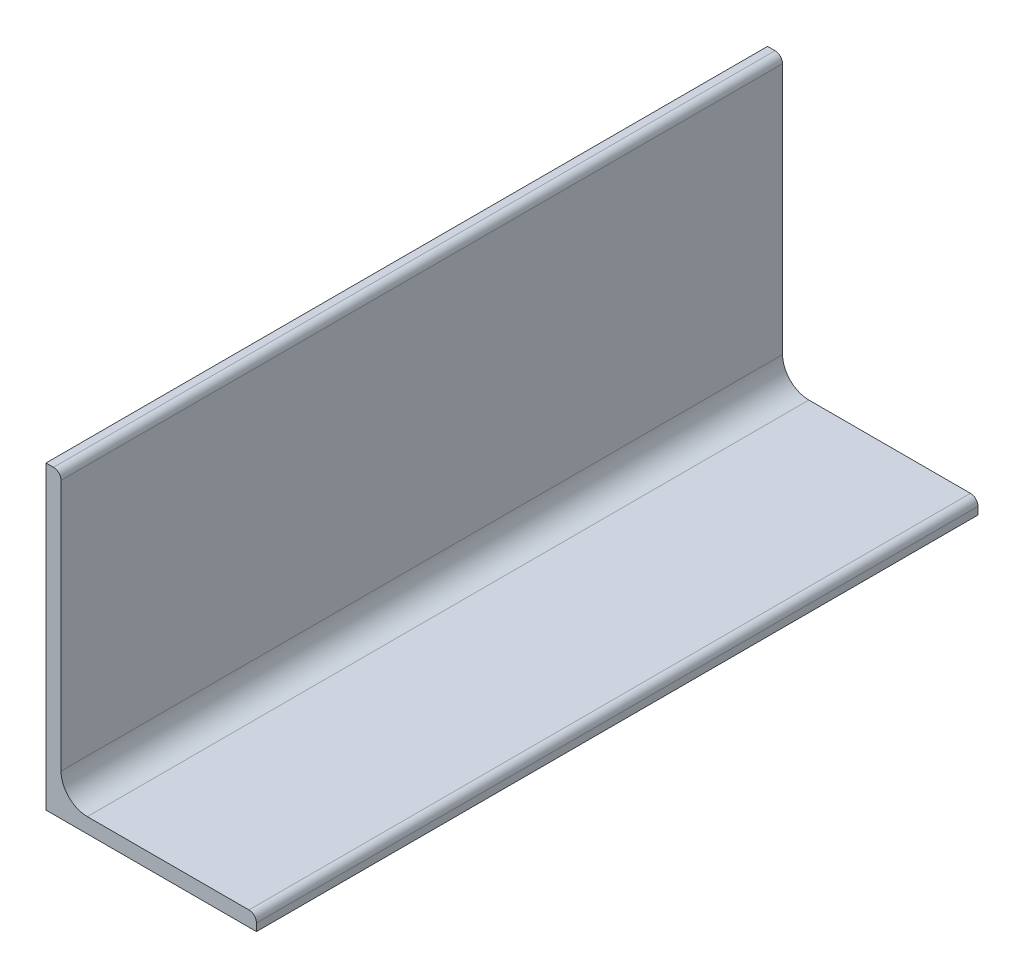
ISO-10303-21;
HEADER;
FILE_DESCRIPTION(('STEP AP214'),'2;1');
FILE_NAME('part.step','',(''),(''),'','','');
FILE_SCHEMA(('AUTOMOTIVE_DESIGN { 1 0 10303 214 1 1 1 1 }'));
ENDSEC;
DATA;
#1=APPLICATION_CONTEXT('core data for automotive mechanical design processes');
#2=APPLICATION_PROTOCOL_DEFINITION('international standard','automotive_design',2000,#1);
#3=PRODUCT_CONTEXT('',#1,'mechanical');
#4=PRODUCT('Part','Part','',(#3));
#5=PRODUCT_RELATED_PRODUCT_CATEGORY('part','',(#4));
#6=PRODUCT_DEFINITION_FORMATION('','',#4);
#7=PRODUCT_DEFINITION_CONTEXT('part definition',#1,'design');
#8=PRODUCT_DEFINITION('design','',#6,#7);
#9=PRODUCT_DEFINITION_SHAPE('','',#8);
#10=(LENGTH_UNIT() NAMED_UNIT(*) SI_UNIT(.MILLI.,.METRE.));
#11=(NAMED_UNIT(*) PLANE_ANGLE_UNIT() SI_UNIT($,.RADIAN.));
#12=(NAMED_UNIT(*) SI_UNIT($,.STERADIAN.) SOLID_ANGLE_UNIT());
#13=UNCERTAINTY_MEASURE_WITH_UNIT(LENGTH_MEASURE(1.E-05),#10,'distance_accuracy_value','');
#14=(GEOMETRIC_REPRESENTATION_CONTEXT(3) GLOBAL_UNCERTAINTY_ASSIGNED_CONTEXT((#13)) GLOBAL_UNIT_ASSIGNED_CONTEXT((#10,
#11,#12)) REPRESENTATION_CONTEXT('',''));
#15=CARTESIAN_POINT('',(0.,0.,0.));
#16=DIRECTION('',(0.,0.,1.));
#17=DIRECTION('',(1.,0.,0.));
#18=AXIS2_PLACEMENT_3D('',#15,#16,#17);
#19=CARTESIAN_POINT('',(0.0836264027816469,127.041655270204,304.8));
#20=DIRECTION('',(1.,0.,0.));
#21=DIRECTION('',(0.,0.,-1.));
#22=AXIS2_PLACEMENT_3D('',#19,#20,#21);
#23=PLANE('',#22);
#24=DIRECTION('',(0.,-1.,0.));
#25=VECTOR('',#24,1.);
#26=CARTESIAN_POINT('',(0.0836264027816469,127.041655270204,0.));
#27=LINE('',#26,#25);
#28=CARTESIAN_POINT('',(0.0836264027816469,127.041655270204,0.));
#29=VERTEX_POINT('',#28);
#30=CARTESIAN_POINT('',(0.0836264027816469,0.0416552702040917,0.));
#31=VERTEX_POINT('',#30);
#32=EDGE_CURVE('E135',#29,#31,#27,.T.);
#33=ORIENTED_EDGE('',*,*,#32,.T.);
#34=DIRECTION('',(0.,0.,-1.));
#35=VECTOR('',#34,1.);
#36=CARTESIAN_POINT('',(0.0836264027816469,0.0416552702040917,304.8));
#37=LINE('',#36,#35);
#38=CARTESIAN_POINT('',(0.0836264027816469,0.0416552702040917,304.8));
#39=VERTEX_POINT('',#38);
#40=EDGE_CURVE('E11',#39,#31,#37,.T.);
#41=ORIENTED_EDGE('',*,*,#40,.F.);
#42=DIRECTION('',(0.,-1.,0.));
#43=VECTOR('',#42,1.);
#44=CARTESIAN_POINT('',(0.0836264027816469,127.041655270204,304.8));
#45=LINE('',#44,#43);
#46=CARTESIAN_POINT('',(0.0836264027816469,127.041655270204,304.8));
#47=VERTEX_POINT('',#46);
#48=EDGE_CURVE('E151',#47,#39,#45,.T.);
#49=ORIENTED_EDGE('',*,*,#48,.F.);
#50=DIRECTION('',(0.,0.,-1.));
#51=VECTOR('',#50,1.);
#52=CARTESIAN_POINT('',(0.0836264027816469,127.041655270204,304.8));
#53=LINE('',#52,#51);
#54=EDGE_CURVE('E131',#47,#29,#53,.T.);
#55=ORIENTED_EDGE('',*,*,#54,.T.);
#56=EDGE_LOOP('',(#33,#41,#49,#55));
#57=FACE_BOUND('',#56,.T.);
#58=ADVANCED_FACE('F33',(#57),#23,.F.);
#59=CARTESIAN_POINT('',(0.0836264027816469,0.0416552702040917,304.8));
#60=DIRECTION('',(0.,1.,0.));
#61=DIRECTION('',(0.,0.,1.));
#62=AXIS2_PLACEMENT_3D('',#59,#60,#61);
#63=PLANE('',#62);
#64=DIRECTION('',(1.,0.,0.));
#65=VECTOR('',#64,1.);
#66=CARTESIAN_POINT('',(0.0836264027816469,0.0416552702040917,0.));
#67=LINE('',#66,#65);
#68=CARTESIAN_POINT('',(88.9836264027817,0.0416552702040917,0.));
#69=VERTEX_POINT('',#68);
#70=EDGE_CURVE('E138',#31,#69,#67,.T.);
#71=ORIENTED_EDGE('',*,*,#70,.T.);
#72=DIRECTION('',(0.,0.,-1.));
#73=VECTOR('',#72,1.);
#74=CARTESIAN_POINT('',(88.9836264027817,0.0416552702040917,304.8));
#75=LINE('',#74,#73);
#76=CARTESIAN_POINT('',(88.9836264027817,0.0416552702040917,304.8));
#77=VERTEX_POINT('',#76);
#78=EDGE_CURVE('E41',#77,#69,#75,.T.);
#79=ORIENTED_EDGE('',*,*,#78,.F.);
#80=DIRECTION('',(1.,0.,0.));
#81=VECTOR('',#80,1.);
#82=CARTESIAN_POINT('',(0.0836264027816469,0.0416552702040917,304.8));
#83=LINE('',#82,#81);
#84=EDGE_CURVE('E95',#39,#77,#83,.T.);
#85=ORIENTED_EDGE('',*,*,#84,.F.);
#86=ORIENTED_EDGE('',*,*,#40,.T.);
#87=EDGE_LOOP('',(#71,#79,#85,#86));
#88=FACE_BOUND('',#87,.T.);
#89=ADVANCED_FACE('F194',(#88),#63,.F.);
#90=CARTESIAN_POINT('',(88.9836264027817,0.0416552702040917,304.8));
#91=DIRECTION('',(-1.,0.,0.));
#92=DIRECTION('',(0.,0.,1.));
#93=AXIS2_PLACEMENT_3D('',#90,#91,#92);
#94=PLANE('',#93);
#95=DIRECTION('',(0.,1.,0.));
#96=VECTOR('',#95,1.);
#97=CARTESIAN_POINT('',(88.9836264027817,0.0416552702040917,0.));
#98=LINE('',#97,#96);
#99=CARTESIAN_POINT('',(88.9836264027817,3.21665527020409,0.));
#100=VERTEX_POINT('',#99);
#101=EDGE_CURVE('E140',#69,#100,#98,.T.);
#102=ORIENTED_EDGE('',*,*,#101,.T.);
#103=DIRECTION('',(0.,0.,-1.));
#104=VECTOR('',#103,1.);
#105=CARTESIAN_POINT('',(88.9836264027817,3.21665527020409,304.8));
#106=LINE('',#105,#104);
#107=CARTESIAN_POINT('',(88.9836264027817,3.21665527020409,304.8));
#108=VERTEX_POINT('',#107);
#109=EDGE_CURVE('E161',#108,#100,#106,.T.);
#110=ORIENTED_EDGE('',*,*,#109,.F.);
#111=DIRECTION('',(0.,1.,0.));
#112=VECTOR('',#111,1.);
#113=CARTESIAN_POINT('',(88.9836264027817,0.0416552702040917,304.8));
#114=LINE('',#113,#112);
#115=EDGE_CURVE('E169',#77,#108,#114,.T.);
#116=ORIENTED_EDGE('',*,*,#115,.F.);
#117=ORIENTED_EDGE('',*,*,#78,.T.);
#118=EDGE_LOOP('',(#102,#110,#116,#117));
#119=FACE_BOUND('',#118,.T.);
#120=ADVANCED_FACE('F167',(#119),#94,.F.);
#121=CARTESIAN_POINT('',(85.8086264027816,3.21665527020409,304.8));
#122=DIRECTION('',(0.,0.,-1.));
#123=DIRECTION('',(-1.,0.,0.));
#124=AXIS2_PLACEMENT_3D('',#121,#122,#123);
#125=CYLINDRICAL_SURFACE('',#124,3.17500000000001);
#126=CARTESIAN_POINT('',(85.8086264027816,3.21665527020409,0.));
#127=DIRECTION('',(0.,0.,1.));
#128=DIRECTION('',(1.,0.,0.));
#129=AXIS2_PLACEMENT_3D('',#126,#127,#128);
#130=CIRCLE('',#129,3.17500000000001);
#131=CARTESIAN_POINT('',(85.8086264027816,6.3916552702041,0.));
#132=VERTEX_POINT('',#131);
#133=EDGE_CURVE('E142',#100,#132,#130,.T.);
#134=ORIENTED_EDGE('',*,*,#133,.T.);
#135=DIRECTION('',(0.,0.,-1.));
#136=VECTOR('',#135,1.);
#137=CARTESIAN_POINT('',(85.8086264027816,6.3916552702041,304.8));
#138=LINE('',#137,#136);
#139=CARTESIAN_POINT('',(85.8086264027816,6.3916552702041,304.8));
#140=VERTEX_POINT('',#139);
#141=EDGE_CURVE('E158',#140,#132,#138,.T.);
#142=ORIENTED_EDGE('',*,*,#141,.F.);
#143=CARTESIAN_POINT('',(85.8086264027816,3.21665527020409,304.8));
#144=DIRECTION('',(0.,0.,1.));
#145=DIRECTION('',(1.,0.,0.));
#146=AXIS2_PLACEMENT_3D('',#143,#144,#145);
#147=CIRCLE('',#146,3.17500000000001);
#148=EDGE_CURVE('E185',#108,#140,#147,.T.);
#149=ORIENTED_EDGE('',*,*,#148,.F.);
#150=ORIENTED_EDGE('',*,*,#109,.T.);
#151=EDGE_LOOP('',(#134,#142,#149,#150));
#152=FACE_BOUND('',#151,.T.);
#153=ADVANCED_FACE('F178',(#152),#125,.T.);
#154=CARTESIAN_POINT('',(85.8086264027816,6.39165527020409,304.8));
#155=DIRECTION('',(0.,-1.,0.));
#156=DIRECTION('',(0.,0.,-1.));
#157=AXIS2_PLACEMENT_3D('',#154,#155,#156);
#158=PLANE('',#157);
#159=DIRECTION('',(-1.,0.,0.));
#160=VECTOR('',#159,1.);
#161=CARTESIAN_POINT('',(85.8086264027816,6.39165527020409,0.));
#162=LINE('',#161,#160);
#163=CARTESIAN_POINT('',(17.5461264027816,6.39165527020409,0.));
#164=VERTEX_POINT('',#163);
#165=EDGE_CURVE('E144',#132,#164,#162,.T.);
#166=ORIENTED_EDGE('',*,*,#165,.T.);
#167=DIRECTION('',(0.,0.,-1.));
#168=VECTOR('',#167,1.);
#169=CARTESIAN_POINT('',(17.5461264027816,6.39165527020409,304.8));
#170=LINE('',#169,#168);
#171=CARTESIAN_POINT('',(17.5461264027816,6.39165527020409,304.8));
#172=VERTEX_POINT('',#171);
#173=EDGE_CURVE('E155',#172,#164,#170,.T.);
#174=ORIENTED_EDGE('',*,*,#173,.F.);
#175=DIRECTION('',(-1.,0.,0.));
#176=VECTOR('',#175,1.);
#177=CARTESIAN_POINT('',(85.8086264027816,6.39165527020409,304.8));
#178=LINE('',#177,#176);
#179=EDGE_CURVE('E184',#140,#172,#178,.T.);
#180=ORIENTED_EDGE('',*,*,#179,.F.);
#181=ORIENTED_EDGE('',*,*,#141,.T.);
#182=EDGE_LOOP('',(#166,#174,#180,#181));
#183=FACE_BOUND('',#182,.T.);
#184=ADVANCED_FACE('F182',(#183),#158,.F.);
#185=CARTESIAN_POINT('',(17.5461264027816,17.5041552702041,304.8));
#186=DIRECTION('',(0.,0.,-1.));
#187=DIRECTION('',(-1.,0.,0.));
#188=AXIS2_PLACEMENT_3D('',#185,#186,#187);
#189=CYLINDRICAL_SURFACE('',#188,11.1125);
#190=CARTESIAN_POINT('',(17.5461264027816,17.5041552702041,0.));
#191=DIRECTION('',(0.,0.,-1.));
#192=DIRECTION('',(1.,0.,0.));
#193=AXIS2_PLACEMENT_3D('',#190,#191,#192);
#194=CIRCLE('',#193,11.1125);
#195=CARTESIAN_POINT('',(6.43362640278164,17.5041552702041,0.));
#196=VERTEX_POINT('',#195);
#197=EDGE_CURVE('E146',#164,#196,#194,.T.);
#198=ORIENTED_EDGE('',*,*,#197,.T.);
#199=DIRECTION('',(0.,0.,-1.));
#200=VECTOR('',#199,1.);
#201=CARTESIAN_POINT('',(6.43362640278164,17.5041552702041,304.8));
#202=LINE('',#201,#200);
#203=CARTESIAN_POINT('',(6.43362640278164,17.5041552702041,304.8));
#204=VERTEX_POINT('',#203);
#205=EDGE_CURVE('E126',#204,#196,#202,.T.);
#206=ORIENTED_EDGE('',*,*,#205,.F.);
#207=CARTESIAN_POINT('',(17.5461264027816,17.5041552702041,304.8));
#208=DIRECTION('',(0.,0.,-1.));
#209=DIRECTION('',(1.,0.,0.));
#210=AXIS2_PLACEMENT_3D('',#207,#208,#209);
#211=CIRCLE('',#210,11.1125);
#212=EDGE_CURVE('E117',#172,#204,#211,.T.);
#213=ORIENTED_EDGE('',*,*,#212,.F.);
#214=ORIENTED_EDGE('',*,*,#173,.T.);
#215=EDGE_LOOP('',(#198,#206,#213,#214));
#216=FACE_BOUND('',#215,.T.);
#217=ADVANCED_FACE('F206',(#216),#189,.F.);
#218=CARTESIAN_POINT('',(6.43362640278165,17.5041552702041,304.8));
#219=DIRECTION('',(-1.,0.,0.));
#220=DIRECTION('',(0.,0.,1.));
#221=AXIS2_PLACEMENT_3D('',#218,#219,#220);
#222=PLANE('',#221);
#223=DIRECTION('',(0.,1.,0.));
#224=VECTOR('',#223,1.);
#225=CARTESIAN_POINT('',(6.43362640278165,17.5041552702041,0.));
#226=LINE('',#225,#224);
#227=CARTESIAN_POINT('',(6.43362640278165,123.866655270204,0.));
#228=VERTEX_POINT('',#227);
#229=EDGE_CURVE('E125',#196,#228,#226,.T.);
#230=ORIENTED_EDGE('',*,*,#229,.T.);
#231=DIRECTION('',(0.,0.,-1.));
#232=VECTOR('',#231,1.);
#233=CARTESIAN_POINT('',(6.43362640278165,123.866655270204,304.8));
#234=LINE('',#233,#232);
#235=CARTESIAN_POINT('',(6.43362640278165,123.866655270204,304.8));
#236=VERTEX_POINT('',#235);
#237=EDGE_CURVE('E122',#236,#228,#234,.T.);
#238=ORIENTED_EDGE('',*,*,#237,.F.);
#239=DIRECTION('',(0.,1.,0.));
#240=VECTOR('',#239,1.);
#241=CARTESIAN_POINT('',(6.43362640278165,17.5041552702041,304.8));
#242=LINE('',#241,#240);
#243=EDGE_CURVE('E111',#204,#236,#242,.T.);
#244=ORIENTED_EDGE('',*,*,#243,.F.);
#245=ORIENTED_EDGE('',*,*,#205,.T.);
#246=EDGE_LOOP('',(#230,#238,#244,#245));
#247=FACE_BOUND('',#246,.T.);
#248=ADVANCED_FACE('F123',(#247),#222,.F.);
#249=CARTESIAN_POINT('',(3.25862640278166,123.866655270204,304.8));
#250=DIRECTION('',(0.,0.,-1.));
#251=DIRECTION('',(-1.,0.,0.));
#252=AXIS2_PLACEMENT_3D('',#249,#250,#251);
#253=CYLINDRICAL_SURFACE('',#252,3.175);
#254=CARTESIAN_POINT('',(3.25862640278166,123.866655270204,0.));
#255=DIRECTION('',(0.,0.,1.));
#256=DIRECTION('',(1.,0.,0.));
#257=AXIS2_PLACEMENT_3D('',#254,#255,#256);
#258=CIRCLE('',#257,3.175);
#259=CARTESIAN_POINT('',(3.25862640278165,127.041655270204,0.));
#260=VERTEX_POINT('',#259);
#261=EDGE_CURVE('E81',#228,#260,#258,.T.);
#262=ORIENTED_EDGE('',*,*,#261,.T.);
#263=DIRECTION('',(0.,0.,-1.));
#264=VECTOR('',#263,1.);
#265=CARTESIAN_POINT('',(3.25862640278165,127.041655270204,304.8));
#266=LINE('',#265,#264);
#267=CARTESIAN_POINT('',(3.25862640278165,127.041655270204,304.8));
#268=VERTEX_POINT('',#267);
#269=EDGE_CURVE('E127',#268,#260,#266,.T.);
#270=ORIENTED_EDGE('',*,*,#269,.F.);
#271=CARTESIAN_POINT('',(3.25862640278166,123.866655270204,304.8));
#272=DIRECTION('',(0.,0.,1.));
#273=DIRECTION('',(1.,0.,0.));
#274=AXIS2_PLACEMENT_3D('',#271,#272,#273);
#275=CIRCLE('',#274,3.175);
#276=EDGE_CURVE('E115',#236,#268,#275,.T.);
#277=ORIENTED_EDGE('',*,*,#276,.F.);
#278=ORIENTED_EDGE('',*,*,#237,.T.);
#279=EDGE_LOOP('',(#262,#270,#277,#278));
#280=FACE_BOUND('',#279,.T.);
#281=ADVANCED_FACE('F129',(#280),#253,.T.);
#282=CARTESIAN_POINT('',(3.25862640278165,127.041655270204,304.8));
#283=DIRECTION('',(0.,-1.,0.));
#284=DIRECTION('',(0.,0.,-1.));
#285=AXIS2_PLACEMENT_3D('',#282,#283,#284);
#286=PLANE('',#285);
#287=DIRECTION('',(-1.,0.,0.));
#288=VECTOR('',#287,1.);
#289=CARTESIAN_POINT('',(3.25862640278165,127.041655270204,0.));
#290=LINE('',#289,#288);
#291=EDGE_CURVE('E87',#260,#29,#290,.T.);
#292=ORIENTED_EDGE('',*,*,#291,.T.);
#293=ORIENTED_EDGE('',*,*,#54,.F.);
#294=DIRECTION('',(-1.,0.,0.));
#295=VECTOR('',#294,1.);
#296=CARTESIAN_POINT('',(3.25862640278165,127.041655270204,304.8));
#297=LINE('',#296,#295);
#298=EDGE_CURVE('E49',#268,#47,#297,.T.);
#299=ORIENTED_EDGE('',*,*,#298,.F.);
#300=ORIENTED_EDGE('',*,*,#269,.T.);
#301=EDGE_LOOP('',(#292,#293,#299,#300));
#302=FACE_BOUND('',#301,.T.);
#303=ADVANCED_FACE('F214',(#302),#286,.F.);
#304=CARTESIAN_POINT('',(85.8086264027816,3.21665527020409,304.8));
#305=DIRECTION('',(0.,0.,1.));
#306=DIRECTION('',(1.,0.,0.));
#307=AXIS2_PLACEMENT_3D('',#304,#305,#306);
#308=PLANE('',#307);
#309=ORIENTED_EDGE('',*,*,#48,.T.);
#310=ORIENTED_EDGE('',*,*,#84,.T.);
#311=ORIENTED_EDGE('',*,*,#115,.T.);
#312=ORIENTED_EDGE('',*,*,#148,.T.);
#313=ORIENTED_EDGE('',*,*,#179,.T.);
#314=ORIENTED_EDGE('',*,*,#212,.T.);
#315=ORIENTED_EDGE('',*,*,#243,.T.);
#316=ORIENTED_EDGE('',*,*,#276,.T.);
#317=ORIENTED_EDGE('',*,*,#298,.T.);
#318=EDGE_LOOP('',(#309,#310,#311,#312,#313,#314,#315,#316,#317));
#319=FACE_BOUND('',#318,.T.);
#320=ADVANCED_FACE('F113',(#319),#308,.T.);
#321=CARTESIAN_POINT('',(85.8086264027816,3.21665527020409,0.));
#322=DIRECTION('',(0.,0.,1.));
#323=DIRECTION('',(1.,0.,0.));
#324=AXIS2_PLACEMENT_3D('',#321,#322,#323);
#325=PLANE('',#324);
#326=ORIENTED_EDGE('',*,*,#32,.F.);
#327=ORIENTED_EDGE('',*,*,#291,.F.);
#328=ORIENTED_EDGE('',*,*,#261,.F.);
#329=ORIENTED_EDGE('',*,*,#229,.F.);
#330=ORIENTED_EDGE('',*,*,#197,.F.);
#331=ORIENTED_EDGE('',*,*,#165,.F.);
#332=ORIENTED_EDGE('',*,*,#133,.F.);
#333=ORIENTED_EDGE('',*,*,#101,.F.);
#334=ORIENTED_EDGE('',*,*,#70,.F.);
#335=EDGE_LOOP('',(#326,#327,#328,#329,#330,#331,#332,#333,#334));
#336=FACE_BOUND('',#335,.T.);
#337=ADVANCED_FACE('F173',(#336),#325,.F.);
#338=CLOSED_SHELL('',(#58,#89,#120,#153,#184,#217,#248,#281,#303,#320,#337));
#339=MANIFOLD_SOLID_BREP('B2',#338);
#340=ADVANCED_BREP_SHAPE_REPRESENTATION('',(#18,#339),#14);
#341=SHAPE_DEFINITION_REPRESENTATION(#9,#340);
ENDSEC;
END-ISO-10303-21;
